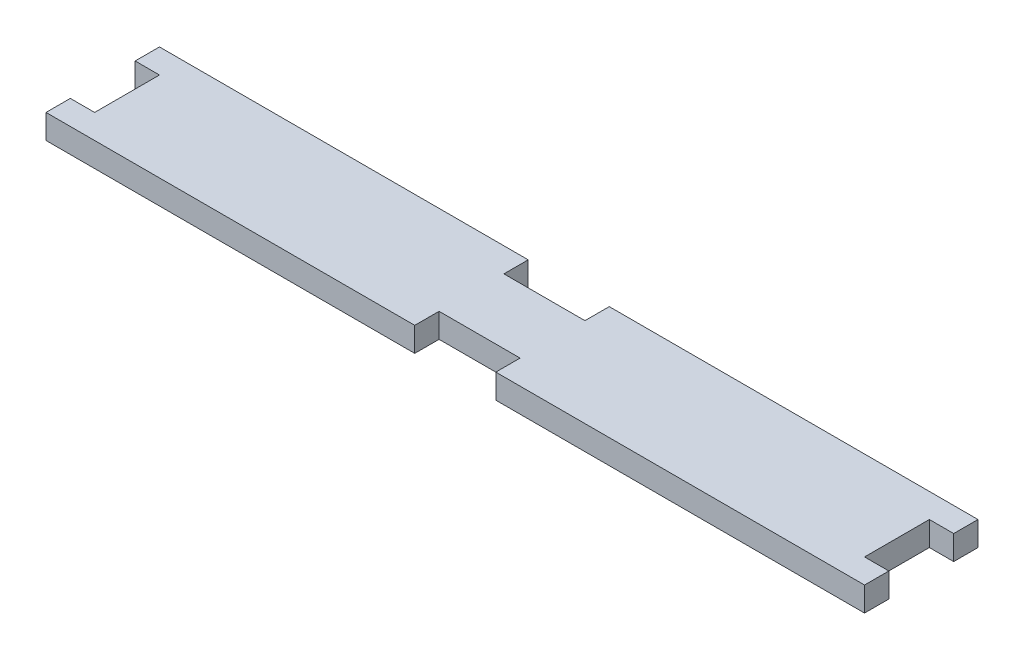
ISO-10303-21;
HEADER;
FILE_DESCRIPTION(('STEP AP214'),'2;1');
FILE_NAME('part.step','',(''),(''),'','','');
FILE_SCHEMA(('AUTOMOTIVE_DESIGN { 1 0 10303 214 1 1 1 1 }'));
ENDSEC;
DATA;
#1=APPLICATION_CONTEXT('core data for automotive mechanical design processes');
#2=APPLICATION_PROTOCOL_DEFINITION('international standard','automotive_design',2000,#1);
#3=PRODUCT_CONTEXT('',#1,'mechanical');
#4=PRODUCT('Part','Part','',(#3));
#5=PRODUCT_RELATED_PRODUCT_CATEGORY('part','',(#4));
#6=PRODUCT_DEFINITION_FORMATION('','',#4);
#7=PRODUCT_DEFINITION_CONTEXT('part definition',#1,'design');
#8=PRODUCT_DEFINITION('design','',#6,#7);
#9=PRODUCT_DEFINITION_SHAPE('','',#8);
#10=(LENGTH_UNIT() NAMED_UNIT(*) SI_UNIT(.MILLI.,.METRE.));
#11=(NAMED_UNIT(*) PLANE_ANGLE_UNIT() SI_UNIT($,.RADIAN.));
#12=(NAMED_UNIT(*) SI_UNIT($,.STERADIAN.) SOLID_ANGLE_UNIT());
#13=UNCERTAINTY_MEASURE_WITH_UNIT(LENGTH_MEASURE(1.E-05),#10,'distance_accuracy_value','');
#14=(GEOMETRIC_REPRESENTATION_CONTEXT(3) GLOBAL_UNCERTAINTY_ASSIGNED_CONTEXT((#13)) GLOBAL_UNIT_ASSIGNED_CONTEXT((#10,
#11,#12)) REPRESENTATION_CONTEXT('',''));
#15=CARTESIAN_POINT('',(0.,0.,0.));
#16=DIRECTION('',(0.,0.,1.));
#17=DIRECTION('',(1.,0.,0.));
#18=AXIS2_PLACEMENT_3D('',#15,#16,#17);
#19=CARTESIAN_POINT('',(98.9969219106057,28.2958445793191,178.000049999986));
#20=DIRECTION('',(-1.,0.,0.));
#21=DIRECTION('',(0.,0.,1.));
#22=AXIS2_PLACEMENT_3D('',#19,#20,#21);
#23=PLANE('',#22);
#24=DIRECTION('',(0.,0.,1.));
#25=VECTOR('',#24,1.);
#26=CARTESIAN_POINT('',(98.9969219106057,28.2958445793191,178.000049999986));
#27=LINE('',#26,#25);
#28=CARTESIAN_POINT('',(98.9969219106057,28.2958445793191,178.000049999986));
#29=VERTEX_POINT('',#28);
#30=CARTESIAN_POINT('',(98.9969219106057,28.2958445793191,184.000049999986));
#31=VERTEX_POINT('',#30);
#32=EDGE_CURVE('E302',#29,#31,#27,.T.);
#33=ORIENTED_EDGE('',*,*,#32,.T.);
#34=DIRECTION('',(0.,1.,0.));
#35=VECTOR('',#34,1.);
#36=CARTESIAN_POINT('',(98.9969219106057,22.2958445793191,184.000049999986));
#37=LINE('',#36,#35);
#38=CARTESIAN_POINT('',(98.9969219106057,22.2958445793191,184.000049999986));
#39=VERTEX_POINT('',#38);
#40=EDGE_CURVE('E207',#39,#31,#37,.T.);
#41=ORIENTED_EDGE('',*,*,#40,.F.);
#42=DIRECTION('',(0.,0.,1.));
#43=VECTOR('',#42,1.);
#44=CARTESIAN_POINT('',(98.9969219106057,22.2958445793191,178.000049999986));
#45=LINE('',#44,#43);
#46=CARTESIAN_POINT('',(98.9969219106057,22.2958445793191,178.000049999986));
#47=VERTEX_POINT('',#46);
#48=EDGE_CURVE('E199',#47,#39,#45,.T.);
#49=ORIENTED_EDGE('',*,*,#48,.F.);
#50=DIRECTION('',(0.,-1.,0.));
#51=VECTOR('',#50,1.);
#52=CARTESIAN_POINT('',(98.9969219106057,28.2958445793191,178.000049999986));
#53=LINE('',#52,#51);
#54=EDGE_CURVE('E284',#29,#47,#53,.T.);
#55=ORIENTED_EDGE('',*,*,#54,.F.);
#56=EDGE_LOOP('',(#33,#41,#49,#55));
#57=FACE_BOUND('',#56,.T.);
#58=ADVANCED_FACE('F35',(#57),#23,.F.);
#59=CARTESIAN_POINT('',(-103.003078089394,28.2958445793191,200.000049999986));
#60=DIRECTION('',(1.,0.,0.));
#61=DIRECTION('',(0.,0.,-1.));
#62=AXIS2_PLACEMENT_3D('',#59,#60,#61);
#63=PLANE('',#62);
#64=DIRECTION('',(0.,0.,1.));
#65=VECTOR('',#64,1.);
#66=CARTESIAN_POINT('',(-103.003078089394,22.2958445793191,200.000049999986));
#67=LINE('',#66,#65);
#68=CARTESIAN_POINT('',(-103.003078089394,22.2958445793191,178.000049999986));
#69=VERTEX_POINT('',#68);
#70=CARTESIAN_POINT('',(-103.003078089394,22.2958445793191,184.000049999986));
#71=VERTEX_POINT('',#70);
#72=EDGE_CURVE('E307',#69,#71,#67,.T.);
#73=ORIENTED_EDGE('',*,*,#72,.T.);
#74=DIRECTION('',(0.,1.,0.));
#75=VECTOR('',#74,1.);
#76=CARTESIAN_POINT('',(-103.003078089394,22.2958445793191,184.000049999986));
#77=LINE('',#76,#75);
#78=CARTESIAN_POINT('',(-103.003078089394,28.2958445793191,184.000049999986));
#79=VERTEX_POINT('',#78);
#80=EDGE_CURVE('E228',#71,#79,#77,.T.);
#81=ORIENTED_EDGE('',*,*,#80,.T.);
#82=DIRECTION('',(0.,0.,1.));
#83=VECTOR('',#82,1.);
#84=CARTESIAN_POINT('',(-103.003078089394,28.2958445793191,200.000049999986));
#85=LINE('',#84,#83);
#86=CARTESIAN_POINT('',(-103.003078089394,28.2958445793191,178.000049999986));
#87=VERTEX_POINT('',#86);
#88=EDGE_CURVE('E308',#87,#79,#85,.T.);
#89=ORIENTED_EDGE('',*,*,#88,.F.);
#90=DIRECTION('',(0.,1.,0.));
#91=VECTOR('',#90,1.);
#92=CARTESIAN_POINT('',(-103.003078089394,22.2958445793191,178.000049999986));
#93=LINE('',#92,#91);
#94=EDGE_CURVE('E291',#69,#87,#93,.T.);
#95=ORIENTED_EDGE('',*,*,#94,.F.);
#96=EDGE_LOOP('',(#73,#81,#89,#95));
#97=FACE_BOUND('',#96,.T.);
#98=ADVANCED_FACE('F385',(#97),#63,.F.);
#99=CARTESIAN_POINT('',(0.,0.,178.000049999986));
#100=DIRECTION('',(0.,0.,-1.));
#101=DIRECTION('',(-1.,0.,0.));
#102=AXIS2_PLACEMENT_3D('',#99,#100,#101);
#103=PLANE('',#102);
#104=DIRECTION('',(0.,1.,0.));
#105=VECTOR('',#104,1.);
#106=CARTESIAN_POINT('',(-12.0030780893943,22.2958445793191,178.000049999986));
#107=LINE('',#106,#105);
#108=CARTESIAN_POINT('',(-12.0030780893943,22.2958445793191,178.000049999986));
#109=VERTEX_POINT('',#108);
#110=CARTESIAN_POINT('',(-12.0030780893943,28.2958445793191,178.000049999986));
#111=VERTEX_POINT('',#110);
#112=EDGE_CURVE('E257',#109,#111,#107,.T.);
#113=ORIENTED_EDGE('',*,*,#112,.F.);
#114=DIRECTION('',(-1.,0.,0.));
#115=VECTOR('',#114,1.);
#116=CARTESIAN_POINT('',(98.9969219106057,22.2958445793191,178.000049999986));
#117=LINE('',#116,#115);
#118=EDGE_CURVE('E287',#109,#69,#117,.T.);
#119=ORIENTED_EDGE('',*,*,#118,.T.);
#120=ORIENTED_EDGE('',*,*,#94,.T.);
#121=DIRECTION('',(1.,0.,0.));
#122=VECTOR('',#121,1.);
#123=CARTESIAN_POINT('',(-103.003078089394,28.2958445793191,178.000049999986));
#124=LINE('',#123,#122);
#125=EDGE_CURVE('E281',#87,#111,#124,.T.);
#126=ORIENTED_EDGE('',*,*,#125,.T.);
#127=EDGE_LOOP('',(#113,#119,#120,#126));
#128=FACE_BOUND('',#127,.T.);
#129=ADVANCED_FACE('F391',(#128),#103,.T.);
#130=CARTESIAN_POINT('',(0.,0.,200.000049999986));
#131=DIRECTION('',(0.,0.,-1.));
#132=DIRECTION('',(-1.,0.,0.));
#133=AXIS2_PLACEMENT_3D('',#130,#131,#132);
#134=PLANE('',#133);
#135=DIRECTION('',(0.,-1.,0.));
#136=VECTOR('',#135,1.);
#137=CARTESIAN_POINT('',(7.99692191060565,28.2958445793191,200.000049999986));
#138=LINE('',#137,#136);
#139=CARTESIAN_POINT('',(7.99692191060565,28.2958445793191,200.000049999986));
#140=VERTEX_POINT('',#139);
#141=CARTESIAN_POINT('',(7.99692191060565,22.2958445793191,200.000049999986));
#142=VERTEX_POINT('',#141);
#143=EDGE_CURVE('E278',#140,#142,#138,.T.);
#144=ORIENTED_EDGE('',*,*,#143,.F.);
#145=DIRECTION('',(1.,0.,0.));
#146=VECTOR('',#145,1.);
#147=CARTESIAN_POINT('',(7.99692191060565,28.2958445793191,200.000049999986));
#148=LINE('',#147,#146);
#149=CARTESIAN_POINT('',(-12.0030780893943,28.2958445793191,200.000049999986));
#150=VERTEX_POINT('',#149);
#151=EDGE_CURVE('E280',#150,#140,#148,.T.);
#152=ORIENTED_EDGE('',*,*,#151,.F.);
#153=DIRECTION('',(0.,-1.,0.));
#154=VECTOR('',#153,1.);
#155=CARTESIAN_POINT('',(-12.0030780893943,28.2958445793191,200.000049999986));
#156=LINE('',#155,#154);
#157=CARTESIAN_POINT('',(-12.0030780893943,22.2958445793191,200.000049999986));
#158=VERTEX_POINT('',#157);
#159=EDGE_CURVE('E45',#150,#158,#156,.T.);
#160=ORIENTED_EDGE('',*,*,#159,.T.);
#161=DIRECTION('',(-1.,0.,0.));
#162=VECTOR('',#161,1.);
#163=CARTESIAN_POINT('',(-12.0030780893943,22.2958445793191,200.000049999986));
#164=LINE('',#163,#162);
#165=EDGE_CURVE('E39',#142,#158,#164,.T.);
#166=ORIENTED_EDGE('',*,*,#165,.F.);
#167=EDGE_LOOP('',(#144,#152,#160,#166));
#168=FACE_BOUND('',#167,.T.);
#169=ADVANCED_FACE('F352',(#168),#134,.F.);
#170=CARTESIAN_POINT('',(-103.003078089394,28.2958445793191,206.000049999986));
#171=DIRECTION('',(0.,0.,-1.));
#172=DIRECTION('',(-1.,0.,0.));
#173=AXIS2_PLACEMENT_3D('',#170,#171,#172);
#174=PLANE('',#173);
#175=DIRECTION('',(1.,0.,0.));
#176=VECTOR('',#175,1.);
#177=CARTESIAN_POINT('',(-103.003078089394,22.2958445793191,206.000049999986));
#178=LINE('',#177,#176);
#179=CARTESIAN_POINT('',(-103.003078089394,22.2958445793191,206.000049999986));
#180=VERTEX_POINT('',#179);
#181=CARTESIAN_POINT('',(-12.0030780893943,22.2958445793191,206.000049999986));
#182=VERTEX_POINT('',#181);
#183=EDGE_CURVE('E313',#180,#182,#178,.T.);
#184=ORIENTED_EDGE('',*,*,#183,.T.);
#185=DIRECTION('',(0.,-1.,0.));
#186=VECTOR('',#185,1.);
#187=CARTESIAN_POINT('',(-12.0030780893943,28.2958445793191,206.000049999986));
#188=LINE('',#187,#186);
#189=CARTESIAN_POINT('',(-12.0030780893943,28.2958445793191,206.000049999986));
#190=VERTEX_POINT('',#189);
#191=EDGE_CURVE('E11',#190,#182,#188,.T.);
#192=ORIENTED_EDGE('',*,*,#191,.F.);
#193=DIRECTION('',(1.,0.,0.));
#194=VECTOR('',#193,1.);
#195=CARTESIAN_POINT('',(-103.003078089394,28.2958445793191,206.000049999986));
#196=LINE('',#195,#194);
#197=CARTESIAN_POINT('',(-103.003078089394,28.2958445793191,206.000049999986));
#198=VERTEX_POINT('',#197);
#199=EDGE_CURVE('E303',#198,#190,#196,.T.);
#200=ORIENTED_EDGE('',*,*,#199,.F.);
#201=DIRECTION('',(0.,-1.,0.));
#202=VECTOR('',#201,1.);
#203=CARTESIAN_POINT('',(-103.003078089394,28.2958445793191,206.000049999986));
#204=LINE('',#203,#202);
#205=EDGE_CURVE('E311',#198,#180,#204,.T.);
#206=ORIENTED_EDGE('',*,*,#205,.T.);
#207=EDGE_LOOP('',(#184,#192,#200,#206));
#208=FACE_BOUND('',#207,.T.);
#209=ADVANCED_FACE('F37',(#208),#174,.F.);
#210=CARTESIAN_POINT('',(-12.0030780893943,28.2958445793191,206.000049999986));
#211=DIRECTION('',(-1.,0.,0.));
#212=DIRECTION('',(0.,0.,1.));
#213=AXIS2_PLACEMENT_3D('',#210,#211,#212);
#214=PLANE('',#213);
#215=DIRECTION('',(0.,0.,-1.));
#216=VECTOR('',#215,1.);
#217=CARTESIAN_POINT('',(-12.0030780893943,22.2958445793191,206.000049999986));
#218=LINE('',#217,#216);
#219=EDGE_CURVE('E316',#182,#158,#218,.T.);
#220=ORIENTED_EDGE('',*,*,#219,.T.);
#221=ORIENTED_EDGE('',*,*,#159,.F.);
#222=DIRECTION('',(0.,0.,-1.));
#223=VECTOR('',#222,1.);
#224=CARTESIAN_POINT('',(-12.0030780893943,28.2958445793191,206.000049999986));
#225=LINE('',#224,#223);
#226=EDGE_CURVE('E306',#190,#150,#225,.T.);
#227=ORIENTED_EDGE('',*,*,#226,.F.);
#228=ORIENTED_EDGE('',*,*,#191,.T.);
#229=EDGE_LOOP('',(#220,#221,#227,#228));
#230=FACE_BOUND('',#229,.T.);
#231=ADVANCED_FACE('F347',(#230),#214,.F.);
#232=CARTESIAN_POINT('',(-103.003078089394,28.2958445793191,200.000049999986));
#233=VERTEX_POINT('',#232);
#234=EDGE_CURVE('E312',#233,#198,#85,.T.);
#235=ORIENTED_EDGE('',*,*,#234,.F.);
#236=DIRECTION('',(0.,1.,0.));
#237=VECTOR('',#236,1.);
#238=CARTESIAN_POINT('',(-103.003078089394,22.2958445793191,200.000049999986));
#239=LINE('',#238,#237);
#240=CARTESIAN_POINT('',(-103.003078089394,22.2958445793191,200.000049999986));
#241=VERTEX_POINT('',#240);
#242=EDGE_CURVE('E221',#241,#233,#239,.T.);
#243=ORIENTED_EDGE('',*,*,#242,.F.);
#244=EDGE_CURVE('E319',#241,#180,#67,.T.);
#245=ORIENTED_EDGE('',*,*,#244,.T.);
#246=ORIENTED_EDGE('',*,*,#205,.F.);
#247=EDGE_LOOP('',(#235,#243,#245,#246));
#248=FACE_BOUND('',#247,.T.);
#249=ADVANCED_FACE('F342',(#248),#63,.F.);
#250=CARTESIAN_POINT('',(0.,28.2958445793191,0.));
#251=DIRECTION('',(0.,1.,0.));
#252=DIRECTION('',(0.,0.,1.));
#253=AXIS2_PLACEMENT_3D('',#250,#251,#252);
#254=PLANE('',#253);
#255=DIRECTION('',(-1.,0.,0.));
#256=VECTOR('',#255,1.);
#257=CARTESIAN_POINT('',(98.9969219106057,28.2958445793191,184.000049999986));
#258=LINE('',#257,#256);
#259=CARTESIAN_POINT('',(92.9969219106056,28.2958445793191,184.000049999986));
#260=VERTEX_POINT('',#259);
#261=EDGE_CURVE('E181',#31,#260,#258,.T.);
#262=ORIENTED_EDGE('',*,*,#261,.F.);
#263=ORIENTED_EDGE('',*,*,#32,.F.);
#264=CARTESIAN_POINT('',(7.99692191060565,28.2958445793191,178.000049999986));
#265=VERTEX_POINT('',#264);
#266=EDGE_CURVE('E285',#265,#29,#124,.T.);
#267=ORIENTED_EDGE('',*,*,#266,.F.);
#268=DIRECTION('',(0.,0.,-1.));
#269=VECTOR('',#268,1.);
#270=CARTESIAN_POINT('',(7.99692191060565,28.2958445793191,184.000049999986));
#271=LINE('',#270,#269);
#272=CARTESIAN_POINT('',(7.99692191060565,28.2958445793191,184.000049999986));
#273=VERTEX_POINT('',#272);
#274=EDGE_CURVE('E250',#273,#265,#271,.T.);
#275=ORIENTED_EDGE('',*,*,#274,.F.);
#276=DIRECTION('',(1.,0.,0.));
#277=VECTOR('',#276,1.);
#278=CARTESIAN_POINT('',(-12.0030780893943,28.2958445793191,184.000049999986));
#279=LINE('',#278,#277);
#280=CARTESIAN_POINT('',(-12.0030780893943,28.2958445793191,184.000049999986));
#281=VERTEX_POINT('',#280);
#282=EDGE_CURVE('E231',#281,#273,#279,.T.);
#283=ORIENTED_EDGE('',*,*,#282,.F.);
#284=DIRECTION('',(0.,0.,1.));
#285=VECTOR('',#284,1.);
#286=CARTESIAN_POINT('',(-12.0030780893943,28.2958445793191,178.000049999986));
#287=LINE('',#286,#285);
#288=EDGE_CURVE('E241',#111,#281,#287,.T.);
#289=ORIENTED_EDGE('',*,*,#288,.F.);
#290=ORIENTED_EDGE('',*,*,#125,.F.);
#291=ORIENTED_EDGE('',*,*,#88,.T.);
#292=DIRECTION('',(-1.,0.,0.));
#293=VECTOR('',#292,1.);
#294=CARTESIAN_POINT('',(-103.003078089394,28.2958445793191,184.000049999986));
#295=LINE('',#294,#293);
#296=CARTESIAN_POINT('',(-97.0030780893944,28.2958445793191,184.000049999986));
#297=VERTEX_POINT('',#296);
#298=EDGE_CURVE('E216',#297,#79,#295,.T.);
#299=ORIENTED_EDGE('',*,*,#298,.F.);
#300=DIRECTION('',(0.,0.,-1.));
#301=VECTOR('',#300,1.);
#302=CARTESIAN_POINT('',(-97.0030780893944,28.2958445793191,184.000049999986));
#303=LINE('',#302,#301);
#304=CARTESIAN_POINT('',(-97.0030780893944,28.2958445793191,200.000049999986));
#305=VERTEX_POINT('',#304);
#306=EDGE_CURVE('E224',#305,#297,#303,.T.);
#307=ORIENTED_EDGE('',*,*,#306,.F.);
#308=DIRECTION('',(1.,0.,0.));
#309=VECTOR('',#308,1.);
#310=CARTESIAN_POINT('',(-103.003078089394,28.2958445793191,200.000049999986));
#311=LINE('',#310,#309);
#312=EDGE_CURVE('E209',#233,#305,#311,.T.);
#313=ORIENTED_EDGE('',*,*,#312,.F.);
#314=ORIENTED_EDGE('',*,*,#234,.T.);
#315=ORIENTED_EDGE('',*,*,#199,.T.);
#316=ORIENTED_EDGE('',*,*,#226,.T.);
#317=ORIENTED_EDGE('',*,*,#151,.T.);
#318=DIRECTION('',(0.,0.,1.));
#319=VECTOR('',#318,1.);
#320=CARTESIAN_POINT('',(7.99692191060565,28.2958445793191,200.000049999986));
#321=LINE('',#320,#319);
#322=CARTESIAN_POINT('',(7.99692191060559,28.2958445793191,206.000049999986));
#323=VERTEX_POINT('',#322);
#324=EDGE_CURVE('E263',#140,#323,#321,.T.);
#325=ORIENTED_EDGE('',*,*,#324,.T.);
#326=DIRECTION('',(1.,0.,0.));
#327=VECTOR('',#326,1.);
#328=CARTESIAN_POINT('',(7.99692191060559,28.2958445793191,206.000049999986));
#329=LINE('',#328,#327);
#330=CARTESIAN_POINT('',(98.9969219106057,28.2958445793191,206.000049999986));
#331=VERTEX_POINT('',#330);
#332=EDGE_CURVE('E265',#323,#331,#329,.T.);
#333=ORIENTED_EDGE('',*,*,#332,.T.);
#334=CARTESIAN_POINT('',(98.9969219106057,28.2958445793191,200.000049999986));
#335=VERTEX_POINT('',#334);
#336=EDGE_CURVE('E366',#335,#331,#27,.T.);
#337=ORIENTED_EDGE('',*,*,#336,.F.);
#338=DIRECTION('',(1.,0.,0.));
#339=VECTOR('',#338,1.);
#340=CARTESIAN_POINT('',(98.9969219106056,28.2958445793191,200.000049999986));
#341=LINE('',#340,#339);
#342=CARTESIAN_POINT('',(92.9969219106056,28.2958445793191,200.000049999986));
#343=VERTEX_POINT('',#342);
#344=EDGE_CURVE('E53',#343,#335,#341,.T.);
#345=ORIENTED_EDGE('',*,*,#344,.F.);
#346=DIRECTION('',(0.,0.,1.));
#347=VECTOR('',#346,1.);
#348=CARTESIAN_POINT('',(92.9969219106056,28.2958445793191,184.000049999986));
#349=LINE('',#348,#347);
#350=EDGE_CURVE('E201',#260,#343,#349,.T.);
#351=ORIENTED_EDGE('',*,*,#350,.F.);
#352=EDGE_LOOP('',(#262,#263,#267,#275,#283,#289,#290,#291,#299,#307,#313,#314,#315,#316,#317,
#325,#333,#337,#345,#351));
#353=FACE_BOUND('',#352,.T.);
#354=ADVANCED_FACE('F336',(#353),#254,.T.);
#355=CARTESIAN_POINT('',(0.,22.2958445793191,0.));
#356=DIRECTION('',(0.,1.,0.));
#357=DIRECTION('',(0.,0.,1.));
#358=AXIS2_PLACEMENT_3D('',#355,#356,#357);
#359=PLANE('',#358);
#360=ORIENTED_EDGE('',*,*,#48,.T.);
#361=DIRECTION('',(-1.,0.,0.));
#362=VECTOR('',#361,1.);
#363=CARTESIAN_POINT('',(98.9969219106057,22.2958445793191,184.000049999986));
#364=LINE('',#363,#362);
#365=CARTESIAN_POINT('',(92.9969219106056,22.2958445793191,184.000049999986));
#366=VERTEX_POINT('',#365);
#367=EDGE_CURVE('E178',#39,#366,#364,.T.);
#368=ORIENTED_EDGE('',*,*,#367,.T.);
#369=DIRECTION('',(0.,0.,1.));
#370=VECTOR('',#369,1.);
#371=CARTESIAN_POINT('',(92.9969219106056,22.2958445793191,184.000049999986));
#372=LINE('',#371,#370);
#373=CARTESIAN_POINT('',(92.9969219106056,22.2958445793191,200.000049999986));
#374=VERTEX_POINT('',#373);
#375=EDGE_CURVE('E189',#366,#374,#372,.T.);
#376=ORIENTED_EDGE('',*,*,#375,.T.);
#377=DIRECTION('',(1.,0.,0.));
#378=VECTOR('',#377,1.);
#379=CARTESIAN_POINT('',(98.9969219106056,22.2958445793191,200.000049999986));
#380=LINE('',#379,#378);
#381=CARTESIAN_POINT('',(98.9969219106056,22.2958445793191,200.000049999986));
#382=VERTEX_POINT('',#381);
#383=EDGE_CURVE('E186',#374,#382,#380,.T.);
#384=ORIENTED_EDGE('',*,*,#383,.T.);
#385=CARTESIAN_POINT('',(98.9969219106057,22.2958445793191,206.000049999986));
#386=VERTEX_POINT('',#385);
#387=EDGE_CURVE('E294',#382,#386,#45,.T.);
#388=ORIENTED_EDGE('',*,*,#387,.T.);
#389=DIRECTION('',(1.,0.,0.));
#390=VECTOR('',#389,1.);
#391=CARTESIAN_POINT('',(7.99692191060559,22.2958445793191,206.000049999986));
#392=LINE('',#391,#390);
#393=CARTESIAN_POINT('',(7.99692191060559,22.2958445793191,206.000049999986));
#394=VERTEX_POINT('',#393);
#395=EDGE_CURVE('E266',#394,#386,#392,.T.);
#396=ORIENTED_EDGE('',*,*,#395,.F.);
#397=DIRECTION('',(0.,0.,1.));
#398=VECTOR('',#397,1.);
#399=CARTESIAN_POINT('',(7.99692191060565,22.2958445793191,200.000049999986));
#400=LINE('',#399,#398);
#401=EDGE_CURVE('E256',#142,#394,#400,.T.);
#402=ORIENTED_EDGE('',*,*,#401,.F.);
#403=ORIENTED_EDGE('',*,*,#165,.T.);
#404=ORIENTED_EDGE('',*,*,#219,.F.);
#405=ORIENTED_EDGE('',*,*,#183,.F.);
#406=ORIENTED_EDGE('',*,*,#244,.F.);
#407=DIRECTION('',(1.,0.,0.));
#408=VECTOR('',#407,1.);
#409=CARTESIAN_POINT('',(-103.003078089394,22.2958445793191,200.000049999986));
#410=LINE('',#409,#408);
#411=CARTESIAN_POINT('',(-97.0030780893944,22.2958445793191,200.000049999986));
#412=VERTEX_POINT('',#411);
#413=EDGE_CURVE('E213',#241,#412,#410,.T.);
#414=ORIENTED_EDGE('',*,*,#413,.T.);
#415=DIRECTION('',(0.,0.,-1.));
#416=VECTOR('',#415,1.);
#417=CARTESIAN_POINT('',(-97.0030780893944,22.2958445793191,184.000049999986));
#418=LINE('',#417,#416);
#419=CARTESIAN_POINT('',(-97.0030780893944,22.2958445793191,184.000049999986));
#420=VERTEX_POINT('',#419);
#421=EDGE_CURVE('E61',#412,#420,#418,.T.);
#422=ORIENTED_EDGE('',*,*,#421,.T.);
#423=DIRECTION('',(-1.,0.,0.));
#424=VECTOR('',#423,1.);
#425=CARTESIAN_POINT('',(-103.003078089394,22.2958445793191,184.000049999986));
#426=LINE('',#425,#424);
#427=EDGE_CURVE('E218',#420,#71,#426,.T.);
#428=ORIENTED_EDGE('',*,*,#427,.T.);
#429=ORIENTED_EDGE('',*,*,#72,.F.);
#430=ORIENTED_EDGE('',*,*,#118,.F.);
#431=DIRECTION('',(0.,0.,1.));
#432=VECTOR('',#431,1.);
#433=CARTESIAN_POINT('',(-12.0030780893943,22.2958445793191,178.000049999986));
#434=LINE('',#433,#432);
#435=CARTESIAN_POINT('',(-12.0030780893943,22.2958445793191,184.000049999986));
#436=VERTEX_POINT('',#435);
#437=EDGE_CURVE('E244',#109,#436,#434,.T.);
#438=ORIENTED_EDGE('',*,*,#437,.T.);
#439=DIRECTION('',(1.,0.,0.));
#440=VECTOR('',#439,1.);
#441=CARTESIAN_POINT('',(-12.0030780893943,22.2958445793191,184.000049999986));
#442=LINE('',#441,#440);
#443=CARTESIAN_POINT('',(7.99692191060565,22.2958445793191,184.000049999986));
#444=VERTEX_POINT('',#443);
#445=EDGE_CURVE('E237',#436,#444,#442,.T.);
#446=ORIENTED_EDGE('',*,*,#445,.T.);
#447=DIRECTION('',(0.,0.,-1.));
#448=VECTOR('',#447,1.);
#449=CARTESIAN_POINT('',(7.99692191060565,22.2958445793191,184.000049999986));
#450=LINE('',#449,#448);
#451=CARTESIAN_POINT('',(7.99692191060566,22.2958445793191,178.000049999986));
#452=VERTEX_POINT('',#451);
#453=EDGE_CURVE('E240',#444,#452,#450,.T.);
#454=ORIENTED_EDGE('',*,*,#453,.T.);
#455=EDGE_CURVE('E288',#47,#452,#117,.T.);
#456=ORIENTED_EDGE('',*,*,#455,.F.);
#457=EDGE_LOOP('',(#360,#368,#376,#384,#388,#396,#402,#403,#404,#405,#406,#414,#422,#428,#429,
#430,#438,#446,#454,#456));
#458=FACE_BOUND('',#457,.T.);
#459=ADVANCED_FACE('F196',(#458),#359,.F.);
#460=ORIENTED_EDGE('',*,*,#387,.F.);
#461=DIRECTION('',(0.,1.,0.));
#462=VECTOR('',#461,1.);
#463=CARTESIAN_POINT('',(98.9969219106056,22.2958445793191,200.000049999986));
#464=LINE('',#463,#462);
#465=EDGE_CURVE('E210',#382,#335,#464,.T.);
#466=ORIENTED_EDGE('',*,*,#465,.T.);
#467=ORIENTED_EDGE('',*,*,#336,.T.);
#468=DIRECTION('',(0.,-1.,0.));
#469=VECTOR('',#468,1.);
#470=CARTESIAN_POINT('',(98.9969219106057,28.2958445793191,206.000049999986));
#471=LINE('',#470,#469);
#472=EDGE_CURVE('E269',#331,#386,#471,.T.);
#473=ORIENTED_EDGE('',*,*,#472,.T.);
#474=EDGE_LOOP('',(#460,#466,#467,#473));
#475=FACE_BOUND('',#474,.T.);
#476=ADVANCED_FACE('F365',(#475),#23,.F.);
#477=DIRECTION('',(0.,1.,0.));
#478=VECTOR('',#477,1.);
#479=CARTESIAN_POINT('',(7.99692191060566,22.2958445793191,178.000049999986));
#480=LINE('',#479,#478);
#481=EDGE_CURVE('E259',#452,#265,#480,.T.);
#482=ORIENTED_EDGE('',*,*,#481,.T.);
#483=ORIENTED_EDGE('',*,*,#266,.T.);
#484=ORIENTED_EDGE('',*,*,#54,.T.);
#485=ORIENTED_EDGE('',*,*,#455,.T.);
#486=EDGE_LOOP('',(#482,#483,#484,#485));
#487=FACE_BOUND('',#486,.T.);
#488=ADVANCED_FACE('F374',(#487),#103,.T.);
#489=CARTESIAN_POINT('',(7.99692191060565,28.2958445793191,200.000049999986));
#490=DIRECTION('',(1.,0.,0.));
#491=DIRECTION('',(0.,0.,-1.));
#492=AXIS2_PLACEMENT_3D('',#489,#490,#491);
#493=PLANE('',#492);
#494=ORIENTED_EDGE('',*,*,#401,.T.);
#495=DIRECTION('',(0.,-1.,0.));
#496=VECTOR('',#495,1.);
#497=CARTESIAN_POINT('',(7.99692191060559,28.2958445793191,206.000049999986));
#498=LINE('',#497,#496);
#499=EDGE_CURVE('E275',#323,#394,#498,.T.);
#500=ORIENTED_EDGE('',*,*,#499,.F.);
#501=ORIENTED_EDGE('',*,*,#324,.F.);
#502=ORIENTED_EDGE('',*,*,#143,.T.);
#503=EDGE_LOOP('',(#494,#500,#501,#502));
#504=FACE_BOUND('',#503,.T.);
#505=ADVANCED_FACE('F358',(#504),#493,.F.);
#506=CARTESIAN_POINT('',(7.99692191060559,28.2958445793191,206.000049999986));
#507=DIRECTION('',(0.,0.,-1.));
#508=DIRECTION('',(-1.,0.,0.));
#509=AXIS2_PLACEMENT_3D('',#506,#507,#508);
#510=PLANE('',#509);
#511=ORIENTED_EDGE('',*,*,#395,.T.);
#512=ORIENTED_EDGE('',*,*,#472,.F.);
#513=ORIENTED_EDGE('',*,*,#332,.F.);
#514=ORIENTED_EDGE('',*,*,#499,.T.);
#515=EDGE_LOOP('',(#511,#512,#513,#514));
#516=FACE_BOUND('',#515,.T.);
#517=ADVANCED_FACE('F362',(#516),#510,.F.);
#518=CARTESIAN_POINT('',(-12.0030780893943,22.2958445793191,184.000049999986));
#519=DIRECTION('',(0.,0.,1.));
#520=DIRECTION('',(1.,0.,0.));
#521=AXIS2_PLACEMENT_3D('',#518,#519,#520);
#522=PLANE('',#521);
#523=ORIENTED_EDGE('',*,*,#282,.T.);
#524=DIRECTION('',(0.,1.,0.));
#525=VECTOR('',#524,1.);
#526=CARTESIAN_POINT('',(7.99692191060565,22.2958445793191,184.000049999986));
#527=LINE('',#526,#525);
#528=EDGE_CURVE('E247',#444,#273,#527,.T.);
#529=ORIENTED_EDGE('',*,*,#528,.F.);
#530=ORIENTED_EDGE('',*,*,#445,.F.);
#531=DIRECTION('',(0.,1.,0.));
#532=VECTOR('',#531,1.);
#533=CARTESIAN_POINT('',(-12.0030780893943,22.2958445793191,184.000049999986));
#534=LINE('',#533,#532);
#535=EDGE_CURVE('E254',#436,#281,#534,.T.);
#536=ORIENTED_EDGE('',*,*,#535,.T.);
#537=EDGE_LOOP('',(#523,#529,#530,#536));
#538=FACE_BOUND('',#537,.T.);
#539=ADVANCED_FACE('F397',(#538),#522,.F.);
#540=CARTESIAN_POINT('',(-12.0030780893943,22.2958445793191,178.000049999986));
#541=DIRECTION('',(-1.,0.,0.));
#542=DIRECTION('',(0.,0.,1.));
#543=AXIS2_PLACEMENT_3D('',#540,#541,#542);
#544=PLANE('',#543);
#545=ORIENTED_EDGE('',*,*,#288,.T.);
#546=ORIENTED_EDGE('',*,*,#535,.F.);
#547=ORIENTED_EDGE('',*,*,#437,.F.);
#548=ORIENTED_EDGE('',*,*,#112,.T.);
#549=EDGE_LOOP('',(#545,#546,#547,#548));
#550=FACE_BOUND('',#549,.T.);
#551=ADVANCED_FACE('F394',(#550),#544,.F.);
#552=CARTESIAN_POINT('',(7.99692191060565,22.2958445793191,184.000049999986));
#553=DIRECTION('',(1.,0.,0.));
#554=DIRECTION('',(0.,0.,-1.));
#555=AXIS2_PLACEMENT_3D('',#552,#553,#554);
#556=PLANE('',#555);
#557=ORIENTED_EDGE('',*,*,#274,.T.);
#558=ORIENTED_EDGE('',*,*,#481,.F.);
#559=ORIENTED_EDGE('',*,*,#453,.F.);
#560=ORIENTED_EDGE('',*,*,#528,.T.);
#561=EDGE_LOOP('',(#557,#558,#559,#560));
#562=FACE_BOUND('',#561,.T.);
#563=ADVANCED_FACE('F401',(#562),#556,.F.);
#564=CARTESIAN_POINT('',(-103.003078089394,22.2958445793191,184.000049999986));
#565=DIRECTION('',(0.,0.,-1.));
#566=DIRECTION('',(-1.,0.,0.));
#567=AXIS2_PLACEMENT_3D('',#564,#565,#566);
#568=PLANE('',#567);
#569=ORIENTED_EDGE('',*,*,#298,.T.);
#570=ORIENTED_EDGE('',*,*,#80,.F.);
#571=ORIENTED_EDGE('',*,*,#427,.F.);
#572=DIRECTION('',(0.,1.,0.));
#573=VECTOR('',#572,1.);
#574=CARTESIAN_POINT('',(-97.0030780893944,22.2958445793191,184.000049999986));
#575=LINE('',#574,#573);
#576=EDGE_CURVE('E232',#420,#297,#575,.T.);
#577=ORIENTED_EDGE('',*,*,#576,.T.);
#578=EDGE_LOOP('',(#569,#570,#571,#577));
#579=FACE_BOUND('',#578,.T.);
#580=ADVANCED_FACE('F383',(#579),#568,.F.);
#581=CARTESIAN_POINT('',(-97.0030780893944,22.2958445793191,184.000049999986));
#582=DIRECTION('',(1.,0.,0.));
#583=DIRECTION('',(0.,0.,-1.));
#584=AXIS2_PLACEMENT_3D('',#581,#582,#583);
#585=PLANE('',#584);
#586=ORIENTED_EDGE('',*,*,#306,.T.);
#587=ORIENTED_EDGE('',*,*,#576,.F.);
#588=ORIENTED_EDGE('',*,*,#421,.F.);
#589=DIRECTION('',(0.,1.,0.));
#590=VECTOR('',#589,1.);
#591=CARTESIAN_POINT('',(-97.0030780893944,22.2958445793191,200.000049999986));
#592=LINE('',#591,#590);
#593=EDGE_CURVE('E234',#412,#305,#592,.T.);
#594=ORIENTED_EDGE('',*,*,#593,.T.);
#595=EDGE_LOOP('',(#586,#587,#588,#594));
#596=FACE_BOUND('',#595,.T.);
#597=ADVANCED_FACE('F378',(#596),#585,.F.);
#598=CARTESIAN_POINT('',(-103.003078089394,22.2958445793191,200.000049999986));
#599=DIRECTION('',(0.,0.,1.));
#600=DIRECTION('',(1.,0.,0.));
#601=AXIS2_PLACEMENT_3D('',#598,#599,#600);
#602=PLANE('',#601);
#603=ORIENTED_EDGE('',*,*,#312,.T.);
#604=ORIENTED_EDGE('',*,*,#593,.F.);
#605=ORIENTED_EDGE('',*,*,#413,.F.);
#606=ORIENTED_EDGE('',*,*,#242,.T.);
#607=EDGE_LOOP('',(#603,#604,#605,#606));
#608=FACE_BOUND('',#607,.T.);
#609=ADVANCED_FACE('F377',(#608),#602,.F.);
#610=CARTESIAN_POINT('',(98.9969219106057,22.2958445793191,184.000049999986));
#611=DIRECTION('',(0.,0.,-1.));
#612=DIRECTION('',(-1.,0.,0.));
#613=AXIS2_PLACEMENT_3D('',#610,#611,#612);
#614=PLANE('',#613);
#615=ORIENTED_EDGE('',*,*,#261,.T.);
#616=DIRECTION('',(0.,1.,0.));
#617=VECTOR('',#616,1.);
#618=CARTESIAN_POINT('',(92.9969219106056,22.2958445793191,184.000049999986));
#619=LINE('',#618,#617);
#620=EDGE_CURVE('E174',#366,#260,#619,.T.);
#621=ORIENTED_EDGE('',*,*,#620,.F.);
#622=ORIENTED_EDGE('',*,*,#367,.F.);
#623=ORIENTED_EDGE('',*,*,#40,.T.);
#624=EDGE_LOOP('',(#615,#621,#622,#623));
#625=FACE_BOUND('',#624,.T.);
#626=ADVANCED_FACE('F176',(#625),#614,.F.);
#627=CARTESIAN_POINT('',(98.9969219106056,22.2958445793191,200.000049999986));
#628=DIRECTION('',(0.,0.,1.));
#629=DIRECTION('',(1.,0.,0.));
#630=AXIS2_PLACEMENT_3D('',#627,#628,#629);
#631=PLANE('',#630);
#632=ORIENTED_EDGE('',*,*,#344,.T.);
#633=ORIENTED_EDGE('',*,*,#465,.F.);
#634=ORIENTED_EDGE('',*,*,#383,.F.);
#635=DIRECTION('',(0.,1.,0.));
#636=VECTOR('',#635,1.);
#637=CARTESIAN_POINT('',(92.9969219106056,22.2958445793191,200.000049999986));
#638=LINE('',#637,#636);
#639=EDGE_CURVE('E185',#374,#343,#638,.T.);
#640=ORIENTED_EDGE('',*,*,#639,.T.);
#641=EDGE_LOOP('',(#632,#633,#634,#640));
#642=FACE_BOUND('',#641,.T.);
#643=ADVANCED_FACE('F368',(#642),#631,.F.);
#644=CARTESIAN_POINT('',(92.9969219106056,22.2958445793191,184.000049999986));
#645=DIRECTION('',(-1.,0.,0.));
#646=DIRECTION('',(0.,0.,1.));
#647=AXIS2_PLACEMENT_3D('',#644,#645,#646);
#648=PLANE('',#647);
#649=ORIENTED_EDGE('',*,*,#350,.T.);
#650=ORIENTED_EDGE('',*,*,#639,.F.);
#651=ORIENTED_EDGE('',*,*,#375,.F.);
#652=ORIENTED_EDGE('',*,*,#620,.T.);
#653=EDGE_LOOP('',(#649,#650,#651,#652));
#654=FACE_BOUND('',#653,.T.);
#655=ADVANCED_FACE('F190',(#654),#648,.F.);
#656=CLOSED_SHELL('',(#58,#98,#129,#169,#209,#231,#249,#354,#459,#476,#488,#505,#517,#539,#551,
#563,#580,#597,#609,#626,#643,#655));
#657=MANIFOLD_SOLID_BREP('B2',#656);
#658=ADVANCED_BREP_SHAPE_REPRESENTATION('',(#18,#657),#14);
#659=SHAPE_DEFINITION_REPRESENTATION(#9,#658);
ENDSEC;
END-ISO-10303-21;
